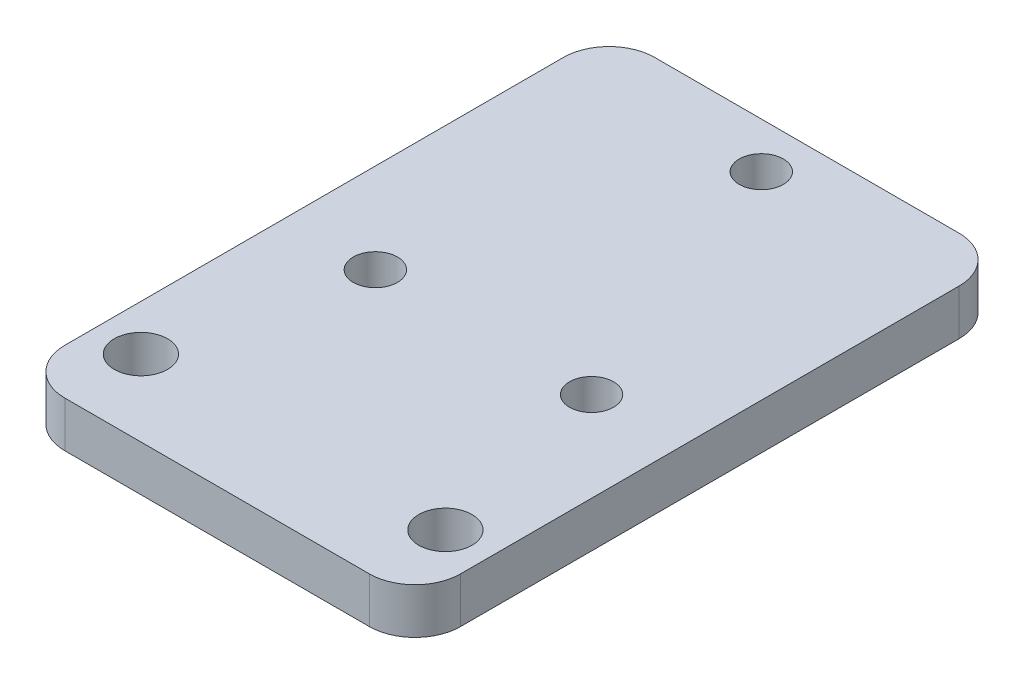
ISO-10303-21;
HEADER;
FILE_DESCRIPTION(('STEP AP214'),'2;1');
FILE_NAME('part.step','',(''),(''),'','','');
FILE_SCHEMA(('AUTOMOTIVE_DESIGN { 1 0 10303 214 1 1 1 1 }'));
ENDSEC;
DATA;
#1=APPLICATION_CONTEXT('core data for automotive mechanical design processes');
#2=APPLICATION_PROTOCOL_DEFINITION('international standard','automotive_design',2000,#1);
#3=PRODUCT_CONTEXT('',#1,'mechanical');
#4=PRODUCT('Part','Part','',(#3));
#5=PRODUCT_RELATED_PRODUCT_CATEGORY('part','',(#4));
#6=PRODUCT_DEFINITION_FORMATION('','',#4);
#7=PRODUCT_DEFINITION_CONTEXT('part definition',#1,'design');
#8=PRODUCT_DEFINITION('design','',#6,#7);
#9=PRODUCT_DEFINITION_SHAPE('','',#8);
#10=(LENGTH_UNIT() NAMED_UNIT(*) SI_UNIT(.MILLI.,.METRE.));
#11=(NAMED_UNIT(*) PLANE_ANGLE_UNIT() SI_UNIT($,.RADIAN.));
#12=(NAMED_UNIT(*) SI_UNIT($,.STERADIAN.) SOLID_ANGLE_UNIT());
#13=UNCERTAINTY_MEASURE_WITH_UNIT(LENGTH_MEASURE(1.E-05),#10,'distance_accuracy_value','');
#14=(GEOMETRIC_REPRESENTATION_CONTEXT(3) GLOBAL_UNCERTAINTY_ASSIGNED_CONTEXT((#13)) GLOBAL_UNIT_ASSIGNED_CONTEXT((#10,
#11,#12)) REPRESENTATION_CONTEXT('',''));
#15=CARTESIAN_POINT('',(0.,0.,0.));
#16=DIRECTION('',(0.,0.,1.));
#17=DIRECTION('',(1.,0.,0.));
#18=AXIS2_PLACEMENT_3D('',#15,#16,#17);
#19=CARTESIAN_POINT('',(0.,3.,0.));
#20=DIRECTION('',(0.,1.,0.));
#21=DIRECTION('',(0.,0.,1.));
#22=AXIS2_PLACEMENT_3D('',#19,#20,#21);
#23=PLANE('',#22);
#24=CARTESIAN_POINT('',(-7.10000000000001,3.,-5.00000000000001));
#25=DIRECTION('',(0.,1.,0.));
#26=DIRECTION('',(0.,0.,1.));
#27=AXIS2_PLACEMENT_3D('',#24,#25,#26);
#28=CIRCLE('',#27,1.45);
#29=CARTESIAN_POINT('',(-7.10000000000001,3.,-3.55000000000001));
#30=VERTEX_POINT('',#29);
#31=EDGE_CURVE('E324',#30,#30,#28,.T.);
#32=ORIENTED_EDGE('',*,*,#31,.F.);
#33=EDGE_LOOP('',(#32));
#34=FACE_BOUND('',#33,.T.);
#35=CARTESIAN_POINT('',(10.,3.,7.5));
#36=DIRECTION('',(0.,1.,0.));
#37=DIRECTION('',(0.,0.,1.));
#38=AXIS2_PLACEMENT_3D('',#35,#36,#37);
#39=CIRCLE('',#38,1.75);
#40=CARTESIAN_POINT('',(10.,3.,9.25));
#41=VERTEX_POINT('',#40);
#42=EDGE_CURVE('E310',#41,#41,#39,.T.);
#43=ORIENTED_EDGE('',*,*,#42,.F.);
#44=EDGE_LOOP('',(#43));
#45=FACE_BOUND('',#44,.T.);
#46=DIRECTION('',(1.,0.,0.));
#47=VECTOR('',#46,1.);
#48=CARTESIAN_POINT('',(-13.,3.,12.5));
#49=LINE('',#48,#47);
#50=CARTESIAN_POINT('',(-9.99999999999999,3.,12.5));
#51=VERTEX_POINT('',#50);
#52=CARTESIAN_POINT('',(10.,3.,12.5));
#53=VERTEX_POINT('',#52);
#54=EDGE_CURVE('E196',#51,#53,#49,.T.);
#55=ORIENTED_EDGE('',*,*,#54,.T.);
#56=CARTESIAN_POINT('',(10.,3.,9.5));
#57=DIRECTION('',(0.,1.,0.));
#58=DIRECTION('',(0.,0.,1.));
#59=AXIS2_PLACEMENT_3D('',#56,#57,#58);
#60=CIRCLE('',#59,3.);
#61=CARTESIAN_POINT('',(13.,3.,9.5));
#62=VERTEX_POINT('',#61);
#63=EDGE_CURVE('E227',#53,#62,#60,.T.);
#64=ORIENTED_EDGE('',*,*,#63,.T.);
#65=DIRECTION('',(0.,0.,-1.));
#66=VECTOR('',#65,1.);
#67=CARTESIAN_POINT('',(13.,3.,-22.5));
#68=LINE('',#67,#66);
#69=CARTESIAN_POINT('',(13.,3.,-23.25));
#70=VERTEX_POINT('',#69);
#71=EDGE_CURVE('E174',#62,#70,#68,.T.);
#72=ORIENTED_EDGE('',*,*,#71,.T.);
#73=CARTESIAN_POINT('',(10.,3.,-23.25));
#74=DIRECTION('',(0.,1.,0.));
#75=DIRECTION('',(0.,0.,1.));
#76=AXIS2_PLACEMENT_3D('',#73,#74,#75);
#77=CIRCLE('',#76,3.);
#78=CARTESIAN_POINT('',(10.,3.,-26.25));
#79=VERTEX_POINT('',#78);
#80=EDGE_CURVE('E221',#70,#79,#77,.T.);
#81=ORIENTED_EDGE('',*,*,#80,.T.);
#82=DIRECTION('',(-1.,0.,0.));
#83=VECTOR('',#82,1.);
#84=CARTESIAN_POINT('',(-13.,3.,-26.25));
#85=LINE('',#84,#83);
#86=CARTESIAN_POINT('',(-10.,3.,-26.25));
#87=VERTEX_POINT('',#86);
#88=EDGE_CURVE('E300',#79,#87,#85,.T.);
#89=ORIENTED_EDGE('',*,*,#88,.T.);
#90=CARTESIAN_POINT('',(-10.,3.,-23.25));
#91=DIRECTION('',(0.,1.,0.));
#92=DIRECTION('',(0.,0.,1.));
#93=AXIS2_PLACEMENT_3D('',#90,#91,#92);
#94=CIRCLE('',#93,3.);
#95=CARTESIAN_POINT('',(-13.,3.,-23.25));
#96=VERTEX_POINT('',#95);
#97=EDGE_CURVE('E224',#87,#96,#94,.T.);
#98=ORIENTED_EDGE('',*,*,#97,.T.);
#99=DIRECTION('',(0.,0.,1.));
#100=VECTOR('',#99,1.);
#101=CARTESIAN_POINT('',(-13.,3.,-22.5));
#102=LINE('',#101,#100);
#103=CARTESIAN_POINT('',(-13.,3.,9.5));
#104=VERTEX_POINT('',#103);
#105=EDGE_CURVE('E297',#96,#104,#102,.T.);
#106=ORIENTED_EDGE('',*,*,#105,.T.);
#107=CARTESIAN_POINT('',(-9.99999999999999,3.,9.5));
#108=DIRECTION('',(0.,1.,0.));
#109=DIRECTION('',(0.,0.,1.));
#110=AXIS2_PLACEMENT_3D('',#107,#108,#109);
#111=CIRCLE('',#110,3.);
#112=EDGE_CURVE('E218',#104,#51,#111,.T.);
#113=ORIENTED_EDGE('',*,*,#112,.T.);
#114=EDGE_LOOP('',(#55,#64,#72,#81,#89,#98,#106,#113));
#115=FACE_BOUND('',#114,.T.);
#116=CARTESIAN_POINT('',(-10.,3.,7.5));
#117=DIRECTION('',(0.,1.,0.));
#118=DIRECTION('',(0.,0.,1.));
#119=AXIS2_PLACEMENT_3D('',#116,#117,#118);
#120=CIRCLE('',#119,1.75);
#121=CARTESIAN_POINT('',(-10.,3.,9.25));
#122=VERTEX_POINT('',#121);
#123=EDGE_CURVE('E185',#122,#122,#120,.T.);
#124=ORIENTED_EDGE('',*,*,#123,.F.);
#125=EDGE_LOOP('',(#124));
#126=FACE_BOUND('',#125,.T.);
#127=CARTESIAN_POINT('',(0.,3.,-23.25));
#128=DIRECTION('',(0.,1.,0.));
#129=DIRECTION('',(0.,0.,1.));
#130=AXIS2_PLACEMENT_3D('',#127,#128,#129);
#131=CIRCLE('',#130,1.45);
#132=CARTESIAN_POINT('',(0.,3.,-21.8));
#133=VERTEX_POINT('',#132);
#134=EDGE_CURVE('E316',#133,#133,#131,.T.);
#135=ORIENTED_EDGE('',*,*,#134,.F.);
#136=EDGE_LOOP('',(#135));
#137=FACE_BOUND('',#136,.T.);
#138=CARTESIAN_POINT('',(7.09999999999999,3.,-5.00000000000001));
#139=DIRECTION('',(0.,1.,0.));
#140=DIRECTION('',(0.,0.,1.));
#141=AXIS2_PLACEMENT_3D('',#138,#139,#140);
#142=CIRCLE('',#141,1.45);
#143=CARTESIAN_POINT('',(7.09999999999999,3.,-3.55000000000001));
#144=VERTEX_POINT('',#143);
#145=EDGE_CURVE('E332',#144,#144,#142,.T.);
#146=ORIENTED_EDGE('',*,*,#145,.F.);
#147=EDGE_LOOP('',(#146));
#148=FACE_BOUND('',#147,.T.);
#149=ADVANCED_FACE('F45',(#34,#45,#115,#126,#137,#148),#23,.T.);
#150=CARTESIAN_POINT('',(0.,0.,0.));
#151=DIRECTION('',(0.,1.,0.));
#152=DIRECTION('',(0.,0.,1.));
#153=AXIS2_PLACEMENT_3D('',#150,#151,#152);
#154=PLANE('',#153);
#155=DIRECTION('',(0.,0.,1.));
#156=VECTOR('',#155,1.);
#157=CARTESIAN_POINT('',(-4.,0.,0.));
#158=LINE('',#157,#156);
#159=CARTESIAN_POINT('',(-4.,0.,-15.6979444337255));
#160=VERTEX_POINT('',#159);
#161=CARTESIAN_POINT('',(-4.,0.,0.));
#162=VERTEX_POINT('',#161);
#163=EDGE_CURVE('E250',#160,#162,#158,.T.);
#164=ORIENTED_EDGE('',*,*,#163,.T.);
#165=DIRECTION('',(-1.,0.,0.));
#166=VECTOR('',#165,1.);
#167=CARTESIAN_POINT('',(2.5,0.,0.));
#168=LINE('',#167,#166);
#169=CARTESIAN_POINT('',(4.,0.,0.));
#170=VERTEX_POINT('',#169);
#171=EDGE_CURVE('E340',#170,#162,#168,.T.);
#172=ORIENTED_EDGE('',*,*,#171,.F.);
#173=DIRECTION('',(0.,0.,1.));
#174=VECTOR('',#173,1.);
#175=CARTESIAN_POINT('',(4.,0.,0.));
#176=LINE('',#175,#174);
#177=CARTESIAN_POINT('',(4.,0.,-15.6979444337255));
#178=VERTEX_POINT('',#177);
#179=EDGE_CURVE('E244',#170,#178,#176,.F.);
#180=ORIENTED_EDGE('',*,*,#179,.T.);
#181=DIRECTION('',(-1.,0.,0.));
#182=VECTOR('',#181,1.);
#183=CARTESIAN_POINT('',(-2.5,0.,-15.6979444337255));
#184=LINE('',#183,#182);
#185=EDGE_CURVE('E247',#178,#160,#184,.T.);
#186=ORIENTED_EDGE('',*,*,#185,.T.);
#187=EDGE_LOOP('',(#164,#172,#180,#186));
#188=FACE_BOUND('',#187,.T.);
#189=DIRECTION('',(0.,0.,-1.));
#190=VECTOR('',#189,1.);
#191=CARTESIAN_POINT('',(13.,0.,-26.25));
#192=LINE('',#191,#190);
#193=CARTESIAN_POINT('',(13.,0.,9.5));
#194=VERTEX_POINT('',#193);
#195=CARTESIAN_POINT('',(13.,0.,-23.25));
#196=VERTEX_POINT('',#195);
#197=EDGE_CURVE('E171',#194,#196,#192,.T.);
#198=ORIENTED_EDGE('',*,*,#197,.F.);
#199=CARTESIAN_POINT('',(10.,0.,9.5));
#200=DIRECTION('',(0.,1.,0.));
#201=DIRECTION('',(0.,0.,1.));
#202=AXIS2_PLACEMENT_3D('',#199,#200,#201);
#203=CIRCLE('',#202,3.);
#204=CARTESIAN_POINT('',(10.,0.,12.5));
#205=VERTEX_POINT('',#204);
#206=EDGE_CURVE('E153',#194,#205,#203,.F.);
#207=ORIENTED_EDGE('',*,*,#206,.T.);
#208=DIRECTION('',(1.,0.,0.));
#209=VECTOR('',#208,1.);
#210=CARTESIAN_POINT('',(-13.,0.,12.5));
#211=LINE('',#210,#209);
#212=CARTESIAN_POINT('',(-9.99999999999999,0.,12.5));
#213=VERTEX_POINT('',#212);
#214=EDGE_CURVE('E202',#213,#205,#211,.T.);
#215=ORIENTED_EDGE('',*,*,#214,.F.);
#216=CARTESIAN_POINT('',(-9.99999999999999,0.,9.5));
#217=DIRECTION('',(0.,1.,0.));
#218=DIRECTION('',(0.,0.,1.));
#219=AXIS2_PLACEMENT_3D('',#216,#217,#218);
#220=CIRCLE('',#219,3.);
#221=CARTESIAN_POINT('',(-13.,0.,9.5));
#222=VERTEX_POINT('',#221);
#223=EDGE_CURVE('E176',#213,#222,#220,.F.);
#224=ORIENTED_EDGE('',*,*,#223,.T.);
#225=DIRECTION('',(0.,0.,1.));
#226=VECTOR('',#225,1.);
#227=CARTESIAN_POINT('',(-13.,0.,-22.5));
#228=LINE('',#227,#226);
#229=CARTESIAN_POINT('',(-13.,0.,-23.25));
#230=VERTEX_POINT('',#229);
#231=EDGE_CURVE('E190',#230,#222,#228,.T.);
#232=ORIENTED_EDGE('',*,*,#231,.F.);
#233=CARTESIAN_POINT('',(-10.,0.,-23.25));
#234=DIRECTION('',(0.,1.,0.));
#235=DIRECTION('',(0.,0.,1.));
#236=AXIS2_PLACEMENT_3D('',#233,#234,#235);
#237=CIRCLE('',#236,3.);
#238=CARTESIAN_POINT('',(-10.,0.,-26.25));
#239=VERTEX_POINT('',#238);
#240=EDGE_CURVE('E165',#230,#239,#237,.F.);
#241=ORIENTED_EDGE('',*,*,#240,.T.);
#242=DIRECTION('',(-1.,0.,0.));
#243=VECTOR('',#242,1.);
#244=CARTESIAN_POINT('',(-13.,0.,-26.25));
#245=LINE('',#244,#243);
#246=CARTESIAN_POINT('',(10.,0.,-26.25));
#247=VERTEX_POINT('',#246);
#248=EDGE_CURVE('E184',#247,#239,#245,.T.);
#249=ORIENTED_EDGE('',*,*,#248,.F.);
#250=CARTESIAN_POINT('',(10.,0.,-23.25));
#251=DIRECTION('',(0.,1.,0.));
#252=DIRECTION('',(0.,0.,1.));
#253=AXIS2_PLACEMENT_3D('',#250,#251,#252);
#254=CIRCLE('',#253,3.);
#255=EDGE_CURVE('E182',#247,#196,#254,.F.);
#256=ORIENTED_EDGE('',*,*,#255,.T.);
#257=EDGE_LOOP('',(#198,#207,#215,#224,#232,#241,#249,#256));
#258=FACE_BOUND('',#257,.T.);
#259=CARTESIAN_POINT('',(-10.,0.,7.5));
#260=DIRECTION('',(0.,1.,0.));
#261=DIRECTION('',(0.,0.,1.));
#262=AXIS2_PLACEMENT_3D('',#259,#260,#261);
#263=CIRCLE('',#262,1.75);
#264=CARTESIAN_POINT('',(-10.,0.,9.25));
#265=VERTEX_POINT('',#264);
#266=EDGE_CURVE('E193',#265,#265,#263,.T.);
#267=ORIENTED_EDGE('',*,*,#266,.T.);
#268=EDGE_LOOP('',(#267));
#269=FACE_BOUND('',#268,.T.);
#270=CARTESIAN_POINT('',(10.,0.,7.5));
#271=DIRECTION('',(0.,1.,0.));
#272=DIRECTION('',(0.,0.,1.));
#273=AXIS2_PLACEMENT_3D('',#270,#271,#272);
#274=CIRCLE('',#273,1.75);
#275=CARTESIAN_POINT('',(10.,0.,9.25));
#276=VERTEX_POINT('',#275);
#277=EDGE_CURVE('E312',#276,#276,#274,.T.);
#278=ORIENTED_EDGE('',*,*,#277,.T.);
#279=EDGE_LOOP('',(#278));
#280=FACE_BOUND('',#279,.T.);
#281=CARTESIAN_POINT('',(0.,0.,-23.25));
#282=DIRECTION('',(0.,1.,0.));
#283=DIRECTION('',(0.,0.,1.));
#284=AXIS2_PLACEMENT_3D('',#281,#282,#283);
#285=CIRCLE('',#284,1.45);
#286=CARTESIAN_POINT('',(0.,0.,-21.8));
#287=VERTEX_POINT('',#286);
#288=EDGE_CURVE('E320',#287,#287,#285,.T.);
#289=ORIENTED_EDGE('',*,*,#288,.T.);
#290=EDGE_LOOP('',(#289));
#291=FACE_BOUND('',#290,.T.);
#292=CARTESIAN_POINT('',(-7.10000000000001,0.,-5.00000000000001));
#293=DIRECTION('',(0.,1.,0.));
#294=DIRECTION('',(0.,0.,1.));
#295=AXIS2_PLACEMENT_3D('',#292,#293,#294);
#296=CIRCLE('',#295,1.45);
#297=CARTESIAN_POINT('',(-7.10000000000001,0.,-3.55000000000001));
#298=VERTEX_POINT('',#297);
#299=EDGE_CURVE('E328',#298,#298,#296,.T.);
#300=ORIENTED_EDGE('',*,*,#299,.T.);
#301=EDGE_LOOP('',(#300));
#302=FACE_BOUND('',#301,.T.);
#303=CARTESIAN_POINT('',(7.09999999999999,0.,-5.00000000000001));
#304=DIRECTION('',(0.,1.,0.));
#305=DIRECTION('',(0.,0.,1.));
#306=AXIS2_PLACEMENT_3D('',#303,#304,#305);
#307=CIRCLE('',#306,1.45);
#308=CARTESIAN_POINT('',(7.09999999999999,0.,-3.55000000000001));
#309=VERTEX_POINT('',#308);
#310=EDGE_CURVE('E336',#309,#309,#307,.T.);
#311=ORIENTED_EDGE('',*,*,#310,.T.);
#312=EDGE_LOOP('',(#311));
#313=FACE_BOUND('',#312,.T.);
#314=ADVANCED_FACE('F179',(#188,#258,#269,#280,#291,#302,#313),#154,.F.);
#315=CARTESIAN_POINT('',(13.,3.,-26.25));
#316=DIRECTION('',(-1.,0.,0.));
#317=DIRECTION('',(0.,0.,1.));
#318=AXIS2_PLACEMENT_3D('',#315,#316,#317);
#319=PLANE('',#318);
#320=ORIENTED_EDGE('',*,*,#71,.F.);
#321=DIRECTION('',(0.,-1.,0.));
#322=VECTOR('',#321,1.);
#323=CARTESIAN_POINT('',(13.,3.,9.5));
#324=LINE('',#323,#322);
#325=EDGE_CURVE('E157',#62,#194,#324,.T.);
#326=ORIENTED_EDGE('',*,*,#325,.T.);
#327=ORIENTED_EDGE('',*,*,#197,.T.);
#328=DIRECTION('',(0.,-1.,0.));
#329=VECTOR('',#328,1.);
#330=CARTESIAN_POINT('',(13.,3.,-23.25));
#331=LINE('',#330,#329);
#332=EDGE_CURVE('E177',#196,#70,#331,.F.);
#333=ORIENTED_EDGE('',*,*,#332,.T.);
#334=EDGE_LOOP('',(#320,#326,#327,#333));
#335=FACE_BOUND('',#334,.T.);
#336=ADVANCED_FACE('F170',(#335),#319,.F.);
#337=CARTESIAN_POINT('',(-13.,3.,-26.25));
#338=DIRECTION('',(0.,0.,1.));
#339=DIRECTION('',(1.,0.,0.));
#340=AXIS2_PLACEMENT_3D('',#337,#338,#339);
#341=PLANE('',#340);
#342=ORIENTED_EDGE('',*,*,#248,.T.);
#343=DIRECTION('',(0.,-1.,0.));
#344=VECTOR('',#343,1.);
#345=CARTESIAN_POINT('',(-10.,3.,-26.25));
#346=LINE('',#345,#344);
#347=EDGE_CURVE('E241',#239,#87,#346,.F.);
#348=ORIENTED_EDGE('',*,*,#347,.T.);
#349=ORIENTED_EDGE('',*,*,#88,.F.);
#350=DIRECTION('',(0.,-1.,0.));
#351=VECTOR('',#350,1.);
#352=CARTESIAN_POINT('',(10.,3.,-26.25));
#353=LINE('',#352,#351);
#354=EDGE_CURVE('E237',#79,#247,#353,.T.);
#355=ORIENTED_EDGE('',*,*,#354,.T.);
#356=EDGE_LOOP('',(#342,#348,#349,#355));
#357=FACE_BOUND('',#356,.T.);
#358=ADVANCED_FACE('F419',(#357),#341,.F.);
#359=CARTESIAN_POINT('',(-13.,3.,-22.5));
#360=DIRECTION('',(1.,0.,0.));
#361=DIRECTION('',(0.,0.,-1.));
#362=AXIS2_PLACEMENT_3D('',#359,#360,#361);
#363=PLANE('',#362);
#364=ORIENTED_EDGE('',*,*,#105,.F.);
#365=DIRECTION('',(0.,-1.,0.));
#366=VECTOR('',#365,1.);
#367=CARTESIAN_POINT('',(-13.,3.,-23.25));
#368=LINE('',#367,#366);
#369=EDGE_CURVE('E233',#96,#230,#368,.T.);
#370=ORIENTED_EDGE('',*,*,#369,.T.);
#371=ORIENTED_EDGE('',*,*,#231,.T.);
#372=DIRECTION('',(0.,-1.,0.));
#373=VECTOR('',#372,1.);
#374=CARTESIAN_POINT('',(-13.,3.,9.5));
#375=LINE('',#374,#373);
#376=EDGE_CURVE('E230',#222,#104,#375,.F.);
#377=ORIENTED_EDGE('',*,*,#376,.T.);
#378=EDGE_LOOP('',(#364,#370,#371,#377));
#379=FACE_BOUND('',#378,.T.);
#380=ADVANCED_FACE('F415',(#379),#363,.F.);
#381=CARTESIAN_POINT('',(-13.,3.,12.5));
#382=DIRECTION('',(0.,0.,-1.));
#383=DIRECTION('',(-1.,0.,0.));
#384=AXIS2_PLACEMENT_3D('',#381,#382,#383);
#385=PLANE('',#384);
#386=ORIENTED_EDGE('',*,*,#214,.T.);
#387=DIRECTION('',(0.,-1.,0.));
#388=VECTOR('',#387,1.);
#389=CARTESIAN_POINT('',(10.,3.,12.5));
#390=LINE('',#389,#388);
#391=EDGE_CURVE('E158',#205,#53,#390,.F.);
#392=ORIENTED_EDGE('',*,*,#391,.T.);
#393=ORIENTED_EDGE('',*,*,#54,.F.);
#394=DIRECTION('',(0.,-1.,0.));
#395=VECTOR('',#394,1.);
#396=CARTESIAN_POINT('',(-9.99999999999999,3.,12.5));
#397=LINE('',#396,#395);
#398=EDGE_CURVE('E164',#51,#213,#397,.T.);
#399=ORIENTED_EDGE('',*,*,#398,.T.);
#400=EDGE_LOOP('',(#386,#392,#393,#399));
#401=FACE_BOUND('',#400,.T.);
#402=ADVANCED_FACE('F412',(#401),#385,.F.);
#403=CARTESIAN_POINT('',(-10.,3.,7.5));
#404=DIRECTION('',(0.,-1.,0.));
#405=DIRECTION('',(0.,0.,-1.));
#406=AXIS2_PLACEMENT_3D('',#403,#404,#405);
#407=CYLINDRICAL_SURFACE('',#406,1.75);
#408=ORIENTED_EDGE('',*,*,#123,.T.);
#409=EDGE_LOOP('',(#408));
#410=FACE_BOUND('',#409,.T.);
#411=ORIENTED_EDGE('',*,*,#266,.F.);
#412=EDGE_LOOP('',(#411));
#413=FACE_BOUND('',#412,.T.);
#414=ADVANCED_FACE('F409',(#410,#413),#407,.F.);
#415=CARTESIAN_POINT('',(10.,3.,7.5));
#416=DIRECTION('',(0.,-1.,0.));
#417=DIRECTION('',(0.,0.,-1.));
#418=AXIS2_PLACEMENT_3D('',#415,#416,#417);
#419=CYLINDRICAL_SURFACE('',#418,1.75);
#420=ORIENTED_EDGE('',*,*,#42,.T.);
#421=EDGE_LOOP('',(#420));
#422=FACE_BOUND('',#421,.T.);
#423=ORIENTED_EDGE('',*,*,#277,.F.);
#424=EDGE_LOOP('',(#423));
#425=FACE_BOUND('',#424,.T.);
#426=ADVANCED_FACE('F510',(#422,#425),#419,.F.);
#427=CARTESIAN_POINT('',(0.,3.,-23.25));
#428=DIRECTION('',(0.,-1.,0.));
#429=DIRECTION('',(0.,0.,-1.));
#430=AXIS2_PLACEMENT_3D('',#427,#428,#429);
#431=CYLINDRICAL_SURFACE('',#430,1.45);
#432=ORIENTED_EDGE('',*,*,#134,.T.);
#433=EDGE_LOOP('',(#432));
#434=FACE_BOUND('',#433,.T.);
#435=ORIENTED_EDGE('',*,*,#288,.F.);
#436=EDGE_LOOP('',(#435));
#437=FACE_BOUND('',#436,.T.);
#438=ADVANCED_FACE('F500',(#434,#437),#431,.F.);
#439=CARTESIAN_POINT('',(-7.10000000000001,3.,-5.00000000000001));
#440=DIRECTION('',(0.,-1.,0.));
#441=DIRECTION('',(0.,0.,-1.));
#442=AXIS2_PLACEMENT_3D('',#439,#440,#441);
#443=CYLINDRICAL_SURFACE('',#442,1.45);
#444=ORIENTED_EDGE('',*,*,#31,.T.);
#445=EDGE_LOOP('',(#444));
#446=FACE_BOUND('',#445,.T.);
#447=ORIENTED_EDGE('',*,*,#299,.F.);
#448=EDGE_LOOP('',(#447));
#449=FACE_BOUND('',#448,.T.);
#450=ADVANCED_FACE('F491',(#446,#449),#443,.F.);
#451=CARTESIAN_POINT('',(7.09999999999999,3.,-5.00000000000001));
#452=DIRECTION('',(0.,-1.,0.));
#453=DIRECTION('',(0.,0.,-1.));
#454=AXIS2_PLACEMENT_3D('',#451,#452,#453);
#455=CYLINDRICAL_SURFACE('',#454,1.45);
#456=ORIENTED_EDGE('',*,*,#145,.T.);
#457=EDGE_LOOP('',(#456));
#458=FACE_BOUND('',#457,.T.);
#459=ORIENTED_EDGE('',*,*,#310,.F.);
#460=EDGE_LOOP('',(#459));
#461=FACE_BOUND('',#460,.T.);
#462=ADVANCED_FACE('F428',(#458,#461),#455,.F.);
#463=CARTESIAN_POINT('',(10.,3.,9.5));
#464=DIRECTION('',(0.,-1.,0.));
#465=DIRECTION('',(0.,0.,-1.));
#466=AXIS2_PLACEMENT_3D('',#463,#464,#465);
#467=CYLINDRICAL_SURFACE('',#466,3.);
#468=ORIENTED_EDGE('',*,*,#63,.F.);
#469=ORIENTED_EDGE('',*,*,#391,.F.);
#470=ORIENTED_EDGE('',*,*,#206,.F.);
#471=ORIENTED_EDGE('',*,*,#325,.F.);
#472=EDGE_LOOP('',(#468,#469,#470,#471));
#473=FACE_BOUND('',#472,.T.);
#474=ADVANCED_FACE('F156',(#473),#467,.T.);
#475=CARTESIAN_POINT('',(-10.,3.,-23.25));
#476=DIRECTION('',(0.,-1.,0.));
#477=DIRECTION('',(0.,0.,-1.));
#478=AXIS2_PLACEMENT_3D('',#475,#476,#477);
#479=CYLINDRICAL_SURFACE('',#478,3.);
#480=ORIENTED_EDGE('',*,*,#97,.F.);
#481=ORIENTED_EDGE('',*,*,#347,.F.);
#482=ORIENTED_EDGE('',*,*,#240,.F.);
#483=ORIENTED_EDGE('',*,*,#369,.F.);
#484=EDGE_LOOP('',(#480,#481,#482,#483));
#485=FACE_BOUND('',#484,.T.);
#486=ADVANCED_FACE('F427',(#485),#479,.T.);
#487=CARTESIAN_POINT('',(10.,3.,-23.25));
#488=DIRECTION('',(0.,-1.,0.));
#489=DIRECTION('',(0.,0.,-1.));
#490=AXIS2_PLACEMENT_3D('',#487,#488,#489);
#491=CYLINDRICAL_SURFACE('',#490,3.);
#492=ORIENTED_EDGE('',*,*,#80,.F.);
#493=ORIENTED_EDGE('',*,*,#332,.F.);
#494=ORIENTED_EDGE('',*,*,#255,.F.);
#495=ORIENTED_EDGE('',*,*,#354,.F.);
#496=EDGE_LOOP('',(#492,#493,#494,#495));
#497=FACE_BOUND('',#496,.T.);
#498=ADVANCED_FACE('F393',(#497),#491,.T.);
#499=CARTESIAN_POINT('',(-9.99999999999999,3.,9.5));
#500=DIRECTION('',(0.,-1.,0.));
#501=DIRECTION('',(0.,0.,-1.));
#502=AXIS2_PLACEMENT_3D('',#499,#500,#501);
#503=CYLINDRICAL_SURFACE('',#502,3.);
#504=ORIENTED_EDGE('',*,*,#112,.F.);
#505=ORIENTED_EDGE('',*,*,#376,.F.);
#506=ORIENTED_EDGE('',*,*,#223,.F.);
#507=ORIENTED_EDGE('',*,*,#398,.F.);
#508=EDGE_LOOP('',(#504,#505,#506,#507));
#509=FACE_BOUND('',#508,.T.);
#510=ADVANCED_FACE('F385',(#509),#503,.T.);
#511=CARTESIAN_POINT('',(2.5,0.,0.));
#512=DIRECTION('',(0.,0.,-1.));
#513=DIRECTION('',(0.,1.,0.));
#514=AXIS2_PLACEMENT_3D('',#511,#512,#513);
#515=PLANE('',#514);
#516=DIRECTION('',(0.,-1.,0.));
#517=VECTOR('',#516,1.);
#518=CARTESIAN_POINT('',(-2.5,0.,0.));
#519=LINE('',#518,#517);
#520=CARTESIAN_POINT('',(-2.5,-1.5,0.));
#521=VERTEX_POINT('',#520);
#522=CARTESIAN_POINT('',(-2.5,-8.14843959181398,0.));
#523=VERTEX_POINT('',#522);
#524=EDGE_CURVE('E288',#521,#523,#519,.T.);
#525=ORIENTED_EDGE('',*,*,#524,.T.);
#526=DIRECTION('',(-1.,0.,0.));
#527=VECTOR('',#526,1.);
#528=CARTESIAN_POINT('',(2.5,-8.14843959181398,0.));
#529=LINE('',#528,#527);
#530=CARTESIAN_POINT('',(2.5,-8.14843959181398,0.));
#531=VERTEX_POINT('',#530);
#532=EDGE_CURVE('E54',#523,#531,#529,.F.);
#533=ORIENTED_EDGE('',*,*,#532,.T.);
#534=DIRECTION('',(0.,-1.,0.));
#535=VECTOR('',#534,1.);
#536=CARTESIAN_POINT('',(2.5,0.,0.));
#537=LINE('',#536,#535);
#538=CARTESIAN_POINT('',(2.5,-1.5,0.));
#539=VERTEX_POINT('',#538);
#540=EDGE_CURVE('E350',#539,#531,#537,.T.);
#541=ORIENTED_EDGE('',*,*,#540,.F.);
#542=CARTESIAN_POINT('',(4.,-1.5,0.));
#543=DIRECTION('',(0.,0.,-1.));
#544=DIRECTION('',(0.,1.,0.));
#545=AXIS2_PLACEMENT_3D('',#542,#543,#544);
#546=CIRCLE('',#545,1.5);
#547=EDGE_CURVE('E271',#539,#170,#546,.T.);
#548=ORIENTED_EDGE('',*,*,#547,.T.);
#549=ORIENTED_EDGE('',*,*,#171,.T.);
#550=CARTESIAN_POINT('',(-4.,-1.5,0.));
#551=DIRECTION('',(0.,0.,-1.));
#552=DIRECTION('',(0.,1.,0.));
#553=AXIS2_PLACEMENT_3D('',#550,#551,#552);
#554=CIRCLE('',#553,1.5);
#555=EDGE_CURVE('E264',#162,#521,#554,.T.);
#556=ORIENTED_EDGE('',*,*,#555,.T.);
#557=EDGE_LOOP('',(#525,#533,#541,#548,#549,#556));
#558=FACE_BOUND('',#557,.T.);
#559=ADVANCED_FACE('F383',(#558),#515,.F.);
#560=CARTESIAN_POINT('',(2.5,-10.,0.));
#561=DIRECTION('',(0.,0.836244367385867,0.548356962220241));
#562=DIRECTION('',(0.,-0.548356962220241,0.836244367385867));
#563=AXIS2_PLACEMENT_3D('',#560,#561,#562);
#564=PLANE('',#563);
#565=DIRECTION('',(0.,0.548356962220241,-0.836244367385867));
#566=VECTOR('',#565,1.);
#567=CARTESIAN_POINT('',(2.5,-10.,0.));
#568=LINE('',#567,#566);
#569=CARTESIAN_POINT('',(2.5,-8.98468395919984,-1.54835696222024));
#570=VERTEX_POINT('',#569);
#571=CARTESIAN_POINT('',(2.5,-1.5,-12.9625));
#572=VERTEX_POINT('',#571);
#573=EDGE_CURVE('E346',#570,#572,#568,.T.);
#574=ORIENTED_EDGE('',*,*,#573,.F.);
#575=DIRECTION('',(-1.,0.,0.));
#576=VECTOR('',#575,1.);
#577=CARTESIAN_POINT('',(2.5,-8.98468395919984,-1.54835696222024));
#578=LINE('',#577,#576);
#579=CARTESIAN_POINT('',(-2.5,-8.98468395919984,-1.54835696222024));
#580=VERTEX_POINT('',#579);
#581=EDGE_CURVE('E279',#570,#580,#578,.T.);
#582=ORIENTED_EDGE('',*,*,#581,.T.);
#583=DIRECTION('',(0.,0.548356962220241,-0.836244367385867));
#584=VECTOR('',#583,1.);
#585=CARTESIAN_POINT('',(-2.5,-10.,0.));
#586=LINE('',#585,#584);
#587=CARTESIAN_POINT('',(-2.5,-1.5,-12.9625));
#588=VERTEX_POINT('',#587);
#589=EDGE_CURVE('E347',#580,#588,#586,.T.);
#590=ORIENTED_EDGE('',*,*,#589,.T.);
#591=CARTESIAN_POINT('',(-4.,-1.5,-12.9625));
#592=DIRECTION('',(0.,0.836244367385867,0.548356962220241));
#593=DIRECTION('',(0.,0.548356962220241,-0.836244367385867));
#594=AXIS2_PLACEMENT_3D('',#591,#592,#593);
#595=ELLIPSE('',#594,2.73544443372553,1.5);
#596=CARTESIAN_POINT('',(-3.17746455666599,-0.245633448921199,-14.8754089903952));
#597=VERTEX_POINT('',#596);
#598=EDGE_CURVE('E267',#588,#597,#595,.T.);
#599=ORIENTED_EDGE('',*,*,#598,.T.);
#600=DIRECTION('',(-1.,0.,0.));
#601=VECTOR('',#600,1.);
#602=CARTESIAN_POINT('',(2.5,-0.2456334489212,-14.8754089903952));
#603=LINE('',#602,#601);
#604=CARTESIAN_POINT('',(3.17746455666599,-0.245633448921199,-14.8754089903952));
#605=VERTEX_POINT('',#604);
#606=EDGE_CURVE('E258',#597,#605,#603,.F.);
#607=ORIENTED_EDGE('',*,*,#606,.T.);
#608=CARTESIAN_POINT('',(4.,-1.5,-12.9625));
#609=DIRECTION('',(0.,0.836244367385867,0.548356962220241));
#610=DIRECTION('',(0.,-0.548356962220241,0.836244367385867));
#611=AXIS2_PLACEMENT_3D('',#608,#609,#610);
#612=ELLIPSE('',#611,2.73544443372553,1.5);
#613=EDGE_CURVE('E275',#605,#572,#612,.T.);
#614=ORIENTED_EDGE('',*,*,#613,.T.);
#615=EDGE_LOOP('',(#574,#582,#590,#599,#607,#614));
#616=FACE_BOUND('',#615,.T.);
#617=ADVANCED_FACE('F365',(#616),#564,.F.);
#618=CARTESIAN_POINT('',(2.5,0.,0.));
#619=DIRECTION('',(1.,0.,0.));
#620=DIRECTION('',(0.,0.,-1.));
#621=AXIS2_PLACEMENT_3D('',#618,#619,#620);
#622=PLANE('',#621);
#623=ORIENTED_EDGE('',*,*,#540,.T.);
#624=CARTESIAN_POINT('',(2.5,-8.14843959181398,-1.));
#625=DIRECTION('',(1.,0.,0.));
#626=DIRECTION('',(0.,0.,-1.));
#627=AXIS2_PLACEMENT_3D('',#624,#625,#626);
#628=CIRCLE('',#627,1.);
#629=EDGE_CURVE('E11',#531,#570,#628,.T.);
#630=ORIENTED_EDGE('',*,*,#629,.T.);
#631=ORIENTED_EDGE('',*,*,#573,.T.);
#632=DIRECTION('',(0.,0.,1.));
#633=VECTOR('',#632,1.);
#634=CARTESIAN_POINT('',(2.5,-1.5,0.));
#635=LINE('',#634,#633);
#636=EDGE_CURVE('E261',#572,#539,#635,.T.);
#637=ORIENTED_EDGE('',*,*,#636,.T.);
#638=EDGE_LOOP('',(#623,#630,#631,#637));
#639=FACE_BOUND('',#638,.T.);
#640=ADVANCED_FACE('F358',(#639),#622,.T.);
#641=CARTESIAN_POINT('',(-2.5,0.,0.));
#642=DIRECTION('',(1.,0.,0.));
#643=DIRECTION('',(0.,0.,-1.));
#644=AXIS2_PLACEMENT_3D('',#641,#642,#643);
#645=PLANE('',#644);
#646=ORIENTED_EDGE('',*,*,#589,.F.);
#647=CARTESIAN_POINT('',(-2.5,-8.14843959181398,-1.));
#648=DIRECTION('',(1.,0.,0.));
#649=DIRECTION('',(0.,0.,-1.));
#650=AXIS2_PLACEMENT_3D('',#647,#648,#649);
#651=CIRCLE('',#650,1.);
#652=EDGE_CURVE('E68',#580,#523,#651,.F.);
#653=ORIENTED_EDGE('',*,*,#652,.T.);
#654=ORIENTED_EDGE('',*,*,#524,.F.);
#655=DIRECTION('',(0.,0.,1.));
#656=VECTOR('',#655,1.);
#657=CARTESIAN_POINT('',(-2.5,-1.5,-15.25));
#658=LINE('',#657,#656);
#659=EDGE_CURVE('E254',#521,#588,#658,.F.);
#660=ORIENTED_EDGE('',*,*,#659,.T.);
#661=EDGE_LOOP('',(#646,#653,#654,#660));
#662=FACE_BOUND('',#661,.T.);
#663=ADVANCED_FACE('F366',(#662),#645,.F.);
#664=CARTESIAN_POINT('',(4.,-1.5,0.));
#665=DIRECTION('',(0.,0.,1.));
#666=DIRECTION('',(1.,0.,0.));
#667=AXIS2_PLACEMENT_3D('',#664,#665,#666);
#668=CYLINDRICAL_SURFACE('',#667,1.5);
#669=ORIENTED_EDGE('',*,*,#636,.F.);
#670=ORIENTED_EDGE('',*,*,#613,.F.);
#671=CARTESIAN_POINT('',(4.,-1.5,-15.6979444337255));
#672=DIRECTION('',(0.707106781186547,0.,0.707106781186547));
#673=DIRECTION('',(-0.707106781186547,0.,0.707106781186547));
#674=AXIS2_PLACEMENT_3D('',#671,#672,#673);
#675=ELLIPSE('',#674,2.12132034355964,1.5);
#676=EDGE_CURVE('E284',#178,#605,#675,.T.);
#677=ORIENTED_EDGE('',*,*,#676,.F.);
#678=ORIENTED_EDGE('',*,*,#179,.F.);
#679=ORIENTED_EDGE('',*,*,#547,.F.);
#680=EDGE_LOOP('',(#669,#670,#677,#678,#679));
#681=FACE_BOUND('',#680,.T.);
#682=ADVANCED_FACE('F378',(#681),#668,.F.);
#683=CARTESIAN_POINT('',(0.,-1.5,-15.6979444337255));
#684=DIRECTION('',(1.,0.,0.));
#685=DIRECTION('',(0.,0.,-1.));
#686=AXIS2_PLACEMENT_3D('',#683,#684,#685);
#687=CYLINDRICAL_SURFACE('',#686,1.5);
#688=ORIENTED_EDGE('',*,*,#606,.F.);
#689=CARTESIAN_POINT('',(-4.,-1.5,-15.6979444337255));
#690=DIRECTION('',(0.707106781186547,0.,-0.707106781186547));
#691=DIRECTION('',(0.707106781186547,0.,0.707106781186547));
#692=AXIS2_PLACEMENT_3D('',#689,#690,#691);
#693=ELLIPSE('',#692,2.12132034355964,1.5);
#694=EDGE_CURVE('E280',#160,#597,#693,.T.);
#695=ORIENTED_EDGE('',*,*,#694,.F.);
#696=ORIENTED_EDGE('',*,*,#185,.F.);
#697=ORIENTED_EDGE('',*,*,#676,.T.);
#698=EDGE_LOOP('',(#688,#695,#696,#697));
#699=FACE_BOUND('',#698,.T.);
#700=ADVANCED_FACE('F381',(#699),#687,.F.);
#701=CARTESIAN_POINT('',(-4.,-1.5,0.));
#702=DIRECTION('',(0.,0.,-1.));
#703=DIRECTION('',(-1.,0.,0.));
#704=AXIS2_PLACEMENT_3D('',#701,#702,#703);
#705=CYLINDRICAL_SURFACE('',#704,1.5);
#706=ORIENTED_EDGE('',*,*,#598,.F.);
#707=ORIENTED_EDGE('',*,*,#659,.F.);
#708=ORIENTED_EDGE('',*,*,#555,.F.);
#709=ORIENTED_EDGE('',*,*,#163,.F.);
#710=ORIENTED_EDGE('',*,*,#694,.T.);
#711=EDGE_LOOP('',(#706,#707,#708,#709,#710));
#712=FACE_BOUND('',#711,.T.);
#713=ADVANCED_FACE('F371',(#712),#705,.F.);
#714=CARTESIAN_POINT('',(2.5,-8.14843959181398,-1.));
#715=DIRECTION('',(-1.,0.,0.));
#716=DIRECTION('',(0.,0.,1.));
#717=AXIS2_PLACEMENT_3D('',#714,#715,#716);
#718=CYLINDRICAL_SURFACE('',#717,1.);
#719=ORIENTED_EDGE('',*,*,#629,.F.);
#720=ORIENTED_EDGE('',*,*,#532,.F.);
#721=ORIENTED_EDGE('',*,*,#652,.F.);
#722=ORIENTED_EDGE('',*,*,#581,.F.);
#723=EDGE_LOOP('',(#719,#720,#721,#722));
#724=FACE_BOUND('',#723,.T.);
#725=ADVANCED_FACE('F47',(#724),#718,.T.);
#726=CLOSED_SHELL('',(#149,#314,#336,#358,#380,#402,#414,#426,#438,#450,#462,#474,#486,#498,
#510,#559,#617,#640,#663,#682,#700,#713,#725));
#727=MANIFOLD_SOLID_BREP('B2',#726);
#728=ADVANCED_BREP_SHAPE_REPRESENTATION('',(#18,#727),#14);
#729=SHAPE_DEFINITION_REPRESENTATION(#9,#728);
ENDSEC;
END-ISO-10303-21;
